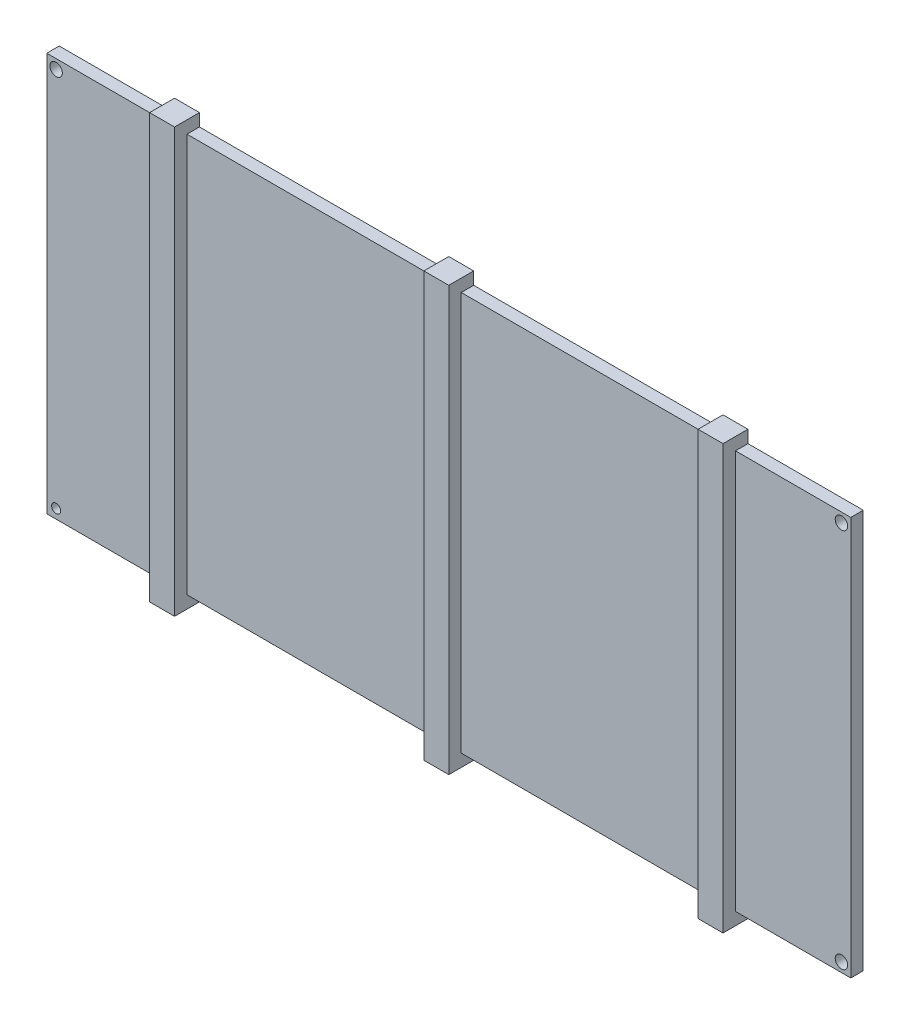
ISO-10303-21;
HEADER;
FILE_DESCRIPTION(('STEP AP214'),'2;1');
FILE_NAME('part.step','',(''),(''),'','','');
FILE_SCHEMA(('AUTOMOTIVE_DESIGN { 1 0 10303 214 1 1 1 1 }'));
ENDSEC;
DATA;
#1=APPLICATION_CONTEXT('core data for automotive mechanical design processes');
#2=APPLICATION_PROTOCOL_DEFINITION('international standard','automotive_design',2000,#1);
#3=PRODUCT_CONTEXT('',#1,'mechanical');
#4=PRODUCT('Part','Part','',(#3));
#5=PRODUCT_RELATED_PRODUCT_CATEGORY('part','',(#4));
#6=PRODUCT_DEFINITION_FORMATION('','',#4);
#7=PRODUCT_DEFINITION_CONTEXT('part definition',#1,'design');
#8=PRODUCT_DEFINITION('design','',#6,#7);
#9=PRODUCT_DEFINITION_SHAPE('','',#8);
#10=(LENGTH_UNIT() NAMED_UNIT(*) SI_UNIT(.MILLI.,.METRE.));
#11=(NAMED_UNIT(*) PLANE_ANGLE_UNIT() SI_UNIT($,.RADIAN.));
#12=(NAMED_UNIT(*) SI_UNIT($,.STERADIAN.) SOLID_ANGLE_UNIT());
#13=UNCERTAINTY_MEASURE_WITH_UNIT(LENGTH_MEASURE(1.E-05),#10,'distance_accuracy_value','');
#14=(GEOMETRIC_REPRESENTATION_CONTEXT(3) GLOBAL_UNCERTAINTY_ASSIGNED_CONTEXT((#13)) GLOBAL_UNIT_ASSIGNED_CONTEXT((#10,
#11,#12)) REPRESENTATION_CONTEXT('',''));
#15=CARTESIAN_POINT('',(0.,0.,0.));
#16=DIRECTION('',(0.,0.,1.));
#17=DIRECTION('',(1.,0.,0.));
#18=AXIS2_PLACEMENT_3D('',#15,#16,#17);
#19=CARTESIAN_POINT('',(0.,0.,2.));
#20=DIRECTION('',(0.,0.,-1.));
#21=DIRECTION('',(-1.,0.,0.));
#22=AXIS2_PLACEMENT_3D('',#19,#20,#21);
#23=PLANE('',#22);
#24=CARTESIAN_POINT('',(259.055719115068,122.680286747834,2.));
#25=DIRECTION('',(0.,0.,1.));
#26=DIRECTION('',(1.,0.,0.));
#27=AXIS2_PLACEMENT_3D('',#24,#25,#26);
#28=CIRCLE('',#27,0.724999999999974);
#29=CARTESIAN_POINT('',(259.780719115068,122.680286747834,2.));
#30=VERTEX_POINT('',#29);
#31=EDGE_CURVE('E379',#30,#30,#28,.T.);
#32=ORIENTED_EDGE('',*,*,#31,.F.);
#33=EDGE_LOOP('',(#32));
#34=FACE_BOUND('',#33,.T.);
#35=CARTESIAN_POINT('',(259.055719115068,183.680286747834,2.));
#36=DIRECTION('',(0.,0.,1.));
#37=DIRECTION('',(1.,0.,0.));
#38=AXIS2_PLACEMENT_3D('',#35,#36,#37);
#39=CIRCLE('',#38,0.999999999999998);
#40=CARTESIAN_POINT('',(260.055719115068,183.680286747834,2.));
#41=VERTEX_POINT('',#40);
#42=EDGE_CURVE('E362',#41,#41,#39,.T.);
#43=ORIENTED_EDGE('',*,*,#42,.F.);
#44=EDGE_LOOP('',(#43));
#45=FACE_BOUND('',#44,.T.);
#46=DIRECTION('',(0.,-1.,0.));
#47=VECTOR('',#46,1.);
#48=CARTESIAN_POINT('',(276.055719115068,187.180286747834,2.));
#49=LINE('',#48,#47);
#50=CARTESIAN_POINT('',(276.055719115068,185.180286747834,2.));
#51=VERTEX_POINT('',#50);
#52=CARTESIAN_POINT('',(276.055719115068,121.180286747834,2.));
#53=VERTEX_POINT('',#52);
#54=EDGE_CURVE('E361',#51,#53,#49,.T.);
#55=ORIENTED_EDGE('',*,*,#54,.F.);
#56=DIRECTION('',(-1.,0.,0.));
#57=VECTOR('',#56,1.);
#58=CARTESIAN_POINT('',(257.555719115068,185.180286747834,2.));
#59=LINE('',#58,#57);
#60=CARTESIAN_POINT('',(257.555719115068,185.180286747834,2.));
#61=VERTEX_POINT('',#60);
#62=EDGE_CURVE('E203',#51,#61,#59,.T.);
#63=ORIENTED_EDGE('',*,*,#62,.T.);
#64=DIRECTION('',(0.,-1.,0.));
#65=VECTOR('',#64,1.);
#66=CARTESIAN_POINT('',(257.555719115068,173.180286747834,2.));
#67=LINE('',#66,#65);
#68=CARTESIAN_POINT('',(257.555719115068,121.180286747834,2.));
#69=VERTEX_POINT('',#68);
#70=EDGE_CURVE('E197',#61,#69,#67,.T.);
#71=ORIENTED_EDGE('',*,*,#70,.T.);
#72=DIRECTION('',(1.,0.,0.));
#73=VECTOR('',#72,1.);
#74=CARTESIAN_POINT('',(276.055719115068,121.180286747834,2.));
#75=LINE('',#74,#73);
#76=EDGE_CURVE('E200',#69,#53,#75,.T.);
#77=ORIENTED_EDGE('',*,*,#76,.T.);
#78=EDGE_LOOP('',(#55,#63,#71,#77));
#79=FACE_BOUND('',#78,.T.);
#80=ADVANCED_FACE('F37',(#34,#45,#79),#23,.F.);
#81=DIRECTION('',(0.,1.,0.));
#82=VECTOR('',#81,1.);
#83=CARTESIAN_POINT('',(280.055719115068,187.180286747834,2.));
#84=LINE('',#83,#82);
#85=CARTESIAN_POINT('',(280.055719115068,121.180286747834,2.));
#86=VERTEX_POINT('',#85);
#87=CARTESIAN_POINT('',(280.055719115068,185.180286747834,2.));
#88=VERTEX_POINT('',#87);
#89=EDGE_CURVE('E385',#86,#88,#84,.T.);
#90=ORIENTED_EDGE('',*,*,#89,.F.);
#91=DIRECTION('',(1.,0.,0.));
#92=VECTOR('',#91,1.);
#93=CARTESIAN_POINT('',(311.555719115068,121.180286747834,2.));
#94=LINE('',#93,#92);
#95=CARTESIAN_POINT('',(320.055719115068,121.180286747834,2.));
#96=VERTEX_POINT('',#95);
#97=EDGE_CURVE('E56',#86,#96,#94,.T.);
#98=ORIENTED_EDGE('',*,*,#97,.T.);
#99=DIRECTION('',(0.,-1.,0.));
#100=VECTOR('',#99,1.);
#101=CARTESIAN_POINT('',(320.055719115068,187.180286747834,2.));
#102=LINE('',#101,#100);
#103=CARTESIAN_POINT('',(320.055719115068,185.180286747834,2.));
#104=VERTEX_POINT('',#103);
#105=EDGE_CURVE('E394',#104,#96,#102,.T.);
#106=ORIENTED_EDGE('',*,*,#105,.F.);
#107=DIRECTION('',(-1.,0.,0.));
#108=VECTOR('',#107,1.);
#109=CARTESIAN_POINT('',(280.055719115068,185.180286747834,2.));
#110=LINE('',#109,#108);
#111=EDGE_CURVE('E435',#104,#88,#110,.T.);
#112=ORIENTED_EDGE('',*,*,#111,.T.);
#113=EDGE_LOOP('',(#90,#98,#106,#112));
#114=FACE_BOUND('',#113,.T.);
#115=ADVANCED_FACE('F438',(#114),#23,.F.);
#116=DIRECTION('',(0.,1.,0.));
#117=VECTOR('',#116,1.);
#118=CARTESIAN_POINT('',(324.055719115068,187.180286747834,2.));
#119=LINE('',#118,#117);
#120=CARTESIAN_POINT('',(324.055719115068,121.180286747834,2.));
#121=VERTEX_POINT('',#120);
#122=CARTESIAN_POINT('',(324.055719115068,185.180286747834,2.));
#123=VERTEX_POINT('',#122);
#124=EDGE_CURVE('E161',#121,#123,#119,.T.);
#125=ORIENTED_EDGE('',*,*,#124,.F.);
#126=DIRECTION('',(1.,0.,0.));
#127=VECTOR('',#126,1.);
#128=CARTESIAN_POINT('',(324.055719115068,121.180286747834,2.));
#129=LINE('',#128,#127);
#130=CARTESIAN_POINT('',(364.055719115068,121.180286747834,2.));
#131=VERTEX_POINT('',#130);
#132=EDGE_CURVE('E283',#121,#131,#129,.T.);
#133=ORIENTED_EDGE('',*,*,#132,.T.);
#134=DIRECTION('',(0.,-1.,0.));
#135=VECTOR('',#134,1.);
#136=CARTESIAN_POINT('',(364.055719115068,187.180286747834,2.));
#137=LINE('',#136,#135);
#138=CARTESIAN_POINT('',(364.055719115068,185.180286747834,2.));
#139=VERTEX_POINT('',#138);
#140=EDGE_CURVE('E11',#139,#131,#137,.T.);
#141=ORIENTED_EDGE('',*,*,#140,.F.);
#142=DIRECTION('',(-1.,0.,0.));
#143=VECTOR('',#142,1.);
#144=CARTESIAN_POINT('',(324.055719115068,185.180286747834,2.));
#145=LINE('',#144,#143);
#146=EDGE_CURVE('E433',#139,#123,#145,.T.);
#147=ORIENTED_EDGE('',*,*,#146,.T.);
#148=EDGE_LOOP('',(#125,#133,#141,#147));
#149=FACE_BOUND('',#148,.T.);
#150=ADVANCED_FACE('F556',(#149),#23,.F.);
#151=CARTESIAN_POINT('',(385.055719115068,183.680286747834,2.));
#152=DIRECTION('',(0.,0.,1.));
#153=DIRECTION('',(1.,0.,0.));
#154=AXIS2_PLACEMENT_3D('',#151,#152,#153);
#155=CIRCLE('',#154,0.999999999999998);
#156=CARTESIAN_POINT('',(386.055719115068,183.680286747834,2.));
#157=VERTEX_POINT('',#156);
#158=EDGE_CURVE('E366',#157,#157,#155,.T.);
#159=ORIENTED_EDGE('',*,*,#158,.F.);
#160=EDGE_LOOP('',(#159));
#161=FACE_BOUND('',#160,.T.);
#162=CARTESIAN_POINT('',(385.055719115068,122.680286747834,2.));
#163=DIRECTION('',(0.,0.,1.));
#164=DIRECTION('',(1.,0.,0.));
#165=AXIS2_PLACEMENT_3D('',#162,#163,#164);
#166=CIRCLE('',#165,0.999999999999998);
#167=CARTESIAN_POINT('',(386.055719115068,122.680286747834,2.));
#168=VERTEX_POINT('',#167);
#169=EDGE_CURVE('E589',#168,#168,#166,.T.);
#170=ORIENTED_EDGE('',*,*,#169,.F.);
#171=EDGE_LOOP('',(#170));
#172=FACE_BOUND('',#171,.T.);
#173=DIRECTION('',(0.,1.,0.));
#174=VECTOR('',#173,1.);
#175=CARTESIAN_POINT('',(368.055719115068,187.180286747834,2.));
#176=LINE('',#175,#174);
#177=CARTESIAN_POINT('',(368.055719115068,121.180286747834,2.));
#178=VERTEX_POINT('',#177);
#179=CARTESIAN_POINT('',(368.055719115068,185.180286747834,2.));
#180=VERTEX_POINT('',#179);
#181=EDGE_CURVE('E47',#178,#180,#176,.T.);
#182=ORIENTED_EDGE('',*,*,#181,.F.);
#183=DIRECTION('',(1.,0.,0.));
#184=VECTOR('',#183,1.);
#185=CARTESIAN_POINT('',(386.555719115068,121.180286747834,2.));
#186=LINE('',#185,#184);
#187=CARTESIAN_POINT('',(386.555719115068,121.180286747834,2.));
#188=VERTEX_POINT('',#187);
#189=EDGE_CURVE('E427',#178,#188,#186,.T.);
#190=ORIENTED_EDGE('',*,*,#189,.T.);
#191=DIRECTION('',(0.,1.,0.));
#192=VECTOR('',#191,1.);
#193=CARTESIAN_POINT('',(386.555719115068,133.180286747834,2.));
#194=LINE('',#193,#192);
#195=CARTESIAN_POINT('',(386.555719115068,185.180286747834,2.));
#196=VERTEX_POINT('',#195);
#197=EDGE_CURVE('E429',#188,#196,#194,.T.);
#198=ORIENTED_EDGE('',*,*,#197,.T.);
#199=DIRECTION('',(-1.,0.,0.));
#200=VECTOR('',#199,1.);
#201=CARTESIAN_POINT('',(368.055719115068,185.180286747834,2.));
#202=LINE('',#201,#200);
#203=EDGE_CURVE('E431',#196,#180,#202,.T.);
#204=ORIENTED_EDGE('',*,*,#203,.T.);
#205=EDGE_LOOP('',(#182,#190,#198,#204));
#206=FACE_BOUND('',#205,.T.);
#207=ADVANCED_FACE('F545',(#161,#172,#206),#23,.F.);
#208=CARTESIAN_POINT('',(322.055719115068,119.180286747834,2.));
#209=DIRECTION('',(0.,1.,0.));
#210=DIRECTION('',(0.,0.,1.));
#211=AXIS2_PLACEMENT_3D('',#208,#209,#210);
#212=PLANE('',#211);
#213=DIRECTION('',(1.,0.,0.));
#214=VECTOR('',#213,1.);
#215=CARTESIAN_POINT('',(322.055719115068,119.180286747834,0.));
#216=LINE('',#215,#214);
#217=CARTESIAN_POINT('',(320.055719115068,119.180286747834,0.));
#218=VERTEX_POINT('',#217);
#219=CARTESIAN_POINT('',(324.055719115068,119.180286747834,0.));
#220=VERTEX_POINT('',#219);
#221=EDGE_CURVE('E152',#218,#220,#216,.T.);
#222=ORIENTED_EDGE('',*,*,#221,.T.);
#223=DIRECTION('',(0.,0.,-1.));
#224=VECTOR('',#223,1.);
#225=CARTESIAN_POINT('',(324.055719115068,119.180286747834,2.));
#226=LINE('',#225,#224);
#227=CARTESIAN_POINT('',(324.055719115068,119.180286747834,4.));
#228=VERTEX_POINT('',#227);
#229=EDGE_CURVE('E355',#228,#220,#226,.T.);
#230=ORIENTED_EDGE('',*,*,#229,.F.);
#231=DIRECTION('',(1.,0.,0.));
#232=VECTOR('',#231,1.);
#233=CARTESIAN_POINT('',(320.055719115068,119.180286747834,4.));
#234=LINE('',#233,#232);
#235=CARTESIAN_POINT('',(320.055719115068,119.180286747834,4.));
#236=VERTEX_POINT('',#235);
#237=EDGE_CURVE('E401',#236,#228,#234,.T.);
#238=ORIENTED_EDGE('',*,*,#237,.F.);
#239=DIRECTION('',(0.,0.,-1.));
#240=VECTOR('',#239,1.);
#241=CARTESIAN_POINT('',(320.055719115068,119.180286747834,2.));
#242=LINE('',#241,#240);
#243=EDGE_CURVE('E221',#236,#218,#242,.T.);
#244=ORIENTED_EDGE('',*,*,#243,.T.);
#245=EDGE_LOOP('',(#222,#230,#238,#244));
#246=FACE_BOUND('',#245,.T.);
#247=ADVANCED_FACE('F39',(#246),#212,.F.);
#248=CARTESIAN_POINT('',(364.055719115068,121.180286747834,2.));
#249=DIRECTION('',(0.,1.,0.));
#250=DIRECTION('',(-1.,0.,0.));
#251=AXIS2_PLACEMENT_3D('',#248,#249,#250);
#252=PLANE('',#251);
#253=DIRECTION('',(1.,0.,0.));
#254=VECTOR('',#253,1.);
#255=CARTESIAN_POINT('',(364.055719115068,121.180286747834,0.));
#256=LINE('',#255,#254);
#257=CARTESIAN_POINT('',(324.055719115068,121.180286747834,0.));
#258=VERTEX_POINT('',#257);
#259=CARTESIAN_POINT('',(364.055719115068,121.180286747834,0.));
#260=VERTEX_POINT('',#259);
#261=EDGE_CURVE('E230',#258,#260,#256,.T.);
#262=ORIENTED_EDGE('',*,*,#261,.T.);
#263=DIRECTION('',(0.,0.,-1.));
#264=VECTOR('',#263,1.);
#265=CARTESIAN_POINT('',(364.055719115068,121.180286747834,2.));
#266=LINE('',#265,#264);
#267=EDGE_CURVE('E349',#131,#260,#266,.T.);
#268=ORIENTED_EDGE('',*,*,#267,.F.);
#269=ORIENTED_EDGE('',*,*,#132,.F.);
#270=DIRECTION('',(0.,0.,-1.));
#271=VECTOR('',#270,1.);
#272=CARTESIAN_POINT('',(324.055719115068,121.180286747834,2.));
#273=LINE('',#272,#271);
#274=EDGE_CURVE('E352',#121,#258,#273,.T.);
#275=ORIENTED_EDGE('',*,*,#274,.T.);
#276=EDGE_LOOP('',(#262,#268,#269,#275));
#277=FACE_BOUND('',#276,.T.);
#278=ADVANCED_FACE('F562',(#277),#252,.F.);
#279=CARTESIAN_POINT('',(368.055719115068,119.180286747834,2.));
#280=DIRECTION('',(0.,1.,0.));
#281=DIRECTION('',(0.,0.,1.));
#282=AXIS2_PLACEMENT_3D('',#279,#280,#281);
#283=PLANE('',#282);
#284=DIRECTION('',(1.,0.,0.));
#285=VECTOR('',#284,1.);
#286=CARTESIAN_POINT('',(368.055719115068,119.180286747834,0.));
#287=LINE('',#286,#285);
#288=CARTESIAN_POINT('',(364.055719115068,119.180286747834,0.));
#289=VERTEX_POINT('',#288);
#290=CARTESIAN_POINT('',(368.055719115068,119.180286747834,0.));
#291=VERTEX_POINT('',#290);
#292=EDGE_CURVE('E234',#289,#291,#287,.T.);
#293=ORIENTED_EDGE('',*,*,#292,.T.);
#294=DIRECTION('',(0.,0.,-1.));
#295=VECTOR('',#294,1.);
#296=CARTESIAN_POINT('',(368.055719115068,119.180286747834,2.));
#297=LINE('',#296,#295);
#298=CARTESIAN_POINT('',(368.055719115068,119.180286747834,4.));
#299=VERTEX_POINT('',#298);
#300=EDGE_CURVE('E343',#299,#291,#297,.T.);
#301=ORIENTED_EDGE('',*,*,#300,.F.);
#302=DIRECTION('',(1.,0.,0.));
#303=VECTOR('',#302,1.);
#304=CARTESIAN_POINT('',(364.055719115068,119.180286747834,4.));
#305=LINE('',#304,#303);
#306=CARTESIAN_POINT('',(364.055719115068,119.180286747834,4.));
#307=VERTEX_POINT('',#306);
#308=EDGE_CURVE('E416',#307,#299,#305,.T.);
#309=ORIENTED_EDGE('',*,*,#308,.F.);
#310=DIRECTION('',(0.,0.,-1.));
#311=VECTOR('',#310,1.);
#312=CARTESIAN_POINT('',(364.055719115068,119.180286747834,2.));
#313=LINE('',#312,#311);
#314=EDGE_CURVE('E346',#307,#289,#313,.T.);
#315=ORIENTED_EDGE('',*,*,#314,.T.);
#316=EDGE_LOOP('',(#293,#301,#309,#315));
#317=FACE_BOUND('',#316,.T.);
#318=ADVANCED_FACE('F529',(#317),#283,.F.);
#319=CARTESIAN_POINT('',(386.555719115068,121.180286747834,2.));
#320=DIRECTION('',(0.,1.,0.));
#321=DIRECTION('',(-1.,0.,0.));
#322=AXIS2_PLACEMENT_3D('',#319,#320,#321);
#323=PLANE('',#322);
#324=DIRECTION('',(1.,0.,0.));
#325=VECTOR('',#324,1.);
#326=CARTESIAN_POINT('',(386.555719115068,121.180286747834,0.));
#327=LINE('',#326,#325);
#328=CARTESIAN_POINT('',(368.055719115068,121.180286747834,0.));
#329=VERTEX_POINT('',#328);
#330=CARTESIAN_POINT('',(386.555719115068,121.180286747834,0.));
#331=VERTEX_POINT('',#330);
#332=EDGE_CURVE('E238',#329,#331,#327,.T.);
#333=ORIENTED_EDGE('',*,*,#332,.T.);
#334=DIRECTION('',(0.,0.,-1.));
#335=VECTOR('',#334,1.);
#336=CARTESIAN_POINT('',(386.555719115068,121.180286747834,2.));
#337=LINE('',#336,#335);
#338=EDGE_CURVE('E337',#188,#331,#337,.T.);
#339=ORIENTED_EDGE('',*,*,#338,.F.);
#340=ORIENTED_EDGE('',*,*,#189,.F.);
#341=DIRECTION('',(0.,0.,-1.));
#342=VECTOR('',#341,1.);
#343=CARTESIAN_POINT('',(368.055719115068,121.180286747834,2.));
#344=LINE('',#343,#342);
#345=EDGE_CURVE('E340',#178,#329,#344,.T.);
#346=ORIENTED_EDGE('',*,*,#345,.T.);
#347=EDGE_LOOP('',(#333,#339,#340,#346));
#348=FACE_BOUND('',#347,.T.);
#349=ADVANCED_FACE('F537',(#348),#323,.F.);
#350=CARTESIAN_POINT('',(386.555719115068,185.180286747834,2.));
#351=DIRECTION('',(-1.,0.,0.));
#352=DIRECTION('',(0.,0.,1.));
#353=AXIS2_PLACEMENT_3D('',#350,#351,#352);
#354=PLANE('',#353);
#355=DIRECTION('',(0.,1.,0.));
#356=VECTOR('',#355,1.);
#357=CARTESIAN_POINT('',(386.555719115068,185.180286747834,0.));
#358=LINE('',#357,#356);
#359=CARTESIAN_POINT('',(386.555719115068,185.180286747834,0.));
#360=VERTEX_POINT('',#359);
#361=EDGE_CURVE('E241',#331,#360,#358,.T.);
#362=ORIENTED_EDGE('',*,*,#361,.T.);
#363=DIRECTION('',(0.,0.,-1.));
#364=VECTOR('',#363,1.);
#365=CARTESIAN_POINT('',(386.555719115068,185.180286747834,2.));
#366=LINE('',#365,#364);
#367=EDGE_CURVE('E334',#196,#360,#366,.T.);
#368=ORIENTED_EDGE('',*,*,#367,.F.);
#369=ORIENTED_EDGE('',*,*,#197,.F.);
#370=ORIENTED_EDGE('',*,*,#338,.T.);
#371=EDGE_LOOP('',(#362,#368,#369,#370));
#372=FACE_BOUND('',#371,.T.);
#373=ADVANCED_FACE('F541',(#372),#354,.F.);
#374=CARTESIAN_POINT('',(368.055719115068,185.180286747834,2.));
#375=DIRECTION('',(0.,-1.,0.));
#376=DIRECTION('',(1.,0.,0.));
#377=AXIS2_PLACEMENT_3D('',#374,#375,#376);
#378=PLANE('',#377);
#379=DIRECTION('',(-1.,0.,0.));
#380=VECTOR('',#379,1.);
#381=CARTESIAN_POINT('',(368.055719115068,185.180286747834,0.));
#382=LINE('',#381,#380);
#383=CARTESIAN_POINT('',(368.055719115068,185.180286747834,0.));
#384=VERTEX_POINT('',#383);
#385=EDGE_CURVE('E243',#360,#384,#382,.T.);
#386=ORIENTED_EDGE('',*,*,#385,.T.);
#387=DIRECTION('',(0.,0.,-1.));
#388=VECTOR('',#387,1.);
#389=CARTESIAN_POINT('',(368.055719115068,185.180286747834,2.));
#390=LINE('',#389,#388);
#391=EDGE_CURVE('E331',#180,#384,#390,.T.);
#392=ORIENTED_EDGE('',*,*,#391,.F.);
#393=ORIENTED_EDGE('',*,*,#203,.F.);
#394=ORIENTED_EDGE('',*,*,#367,.T.);
#395=EDGE_LOOP('',(#386,#392,#393,#394));
#396=FACE_BOUND('',#395,.T.);
#397=ADVANCED_FACE('F657',(#396),#378,.F.);
#398=CARTESIAN_POINT('',(368.055719115068,185.180286747834,2.));
#399=DIRECTION('',(-1.,0.,0.));
#400=DIRECTION('',(0.,0.,1.));
#401=AXIS2_PLACEMENT_3D('',#398,#399,#400);
#402=PLANE('',#401);
#403=DIRECTION('',(0.,1.,0.));
#404=VECTOR('',#403,1.);
#405=CARTESIAN_POINT('',(368.055719115068,185.180286747834,0.));
#406=LINE('',#405,#404);
#407=CARTESIAN_POINT('',(368.055719115068,187.180286747834,0.));
#408=VERTEX_POINT('',#407);
#409=EDGE_CURVE('E245',#384,#408,#406,.T.);
#410=ORIENTED_EDGE('',*,*,#409,.T.);
#411=DIRECTION('',(0.,0.,-1.));
#412=VECTOR('',#411,1.);
#413=CARTESIAN_POINT('',(368.055719115068,187.180286747834,2.));
#414=LINE('',#413,#412);
#415=CARTESIAN_POINT('',(368.055719115068,187.180286747834,4.));
#416=VERTEX_POINT('',#415);
#417=EDGE_CURVE('E328',#416,#408,#414,.T.);
#418=ORIENTED_EDGE('',*,*,#417,.F.);
#419=DIRECTION('',(0.,1.,0.));
#420=VECTOR('',#419,1.);
#421=CARTESIAN_POINT('',(368.055719115068,187.180286747834,4.));
#422=LINE('',#421,#420);
#423=EDGE_CURVE('E419',#299,#416,#422,.T.);
#424=ORIENTED_EDGE('',*,*,#423,.F.);
#425=ORIENTED_EDGE('',*,*,#300,.T.);
#426=DIRECTION('',(0.,1.,0.));
#427=VECTOR('',#426,1.);
#428=CARTESIAN_POINT('',(368.055719115068,121.180286747834,0.));
#429=LINE('',#428,#427);
#430=EDGE_CURVE('E236',#291,#329,#429,.T.);
#431=ORIENTED_EDGE('',*,*,#430,.T.);
#432=ORIENTED_EDGE('',*,*,#345,.F.);
#433=ORIENTED_EDGE('',*,*,#181,.T.);
#434=ORIENTED_EDGE('',*,*,#391,.T.);
#435=EDGE_LOOP('',(#410,#418,#424,#425,#431,#432,#433,#434));
#436=FACE_BOUND('',#435,.T.);
#437=ADVANCED_FACE('F530',(#436),#402,.F.);
#438=CARTESIAN_POINT('',(368.055719115068,187.180286747834,2.));
#439=DIRECTION('',(0.,-1.,0.));
#440=DIRECTION('',(0.,0.,-1.));
#441=AXIS2_PLACEMENT_3D('',#438,#439,#440);
#442=PLANE('',#441);
#443=DIRECTION('',(-1.,0.,0.));
#444=VECTOR('',#443,1.);
#445=CARTESIAN_POINT('',(368.055719115068,187.180286747834,0.));
#446=LINE('',#445,#444);
#447=CARTESIAN_POINT('',(364.055719115068,187.180286747834,0.));
#448=VERTEX_POINT('',#447);
#449=EDGE_CURVE('E247',#408,#448,#446,.T.);
#450=ORIENTED_EDGE('',*,*,#449,.T.);
#451=DIRECTION('',(0.,0.,-1.));
#452=VECTOR('',#451,1.);
#453=CARTESIAN_POINT('',(364.055719115068,187.180286747834,2.));
#454=LINE('',#453,#452);
#455=CARTESIAN_POINT('',(364.055719115068,187.180286747834,4.));
#456=VERTEX_POINT('',#455);
#457=EDGE_CURVE('E325',#456,#448,#454,.T.);
#458=ORIENTED_EDGE('',*,*,#457,.F.);
#459=DIRECTION('',(-1.,0.,0.));
#460=VECTOR('',#459,1.);
#461=CARTESIAN_POINT('',(368.055719115068,187.180286747834,4.));
#462=LINE('',#461,#460);
#463=EDGE_CURVE('E227',#416,#456,#462,.T.);
#464=ORIENTED_EDGE('',*,*,#463,.F.);
#465=ORIENTED_EDGE('',*,*,#417,.T.);
#466=EDGE_LOOP('',(#450,#458,#464,#465));
#467=FACE_BOUND('',#466,.T.);
#468=ADVANCED_FACE('F517',(#467),#442,.F.);
#469=CARTESIAN_POINT('',(364.055719115068,187.180286747834,2.));
#470=DIRECTION('',(1.,0.,0.));
#471=DIRECTION('',(0.,0.,-1.));
#472=AXIS2_PLACEMENT_3D('',#469,#470,#471);
#473=PLANE('',#472);
#474=DIRECTION('',(0.,-1.,0.));
#475=VECTOR('',#474,1.);
#476=CARTESIAN_POINT('',(364.055719115068,187.180286747834,0.));
#477=LINE('',#476,#475);
#478=CARTESIAN_POINT('',(364.055719115068,185.180286747834,0.));
#479=VERTEX_POINT('',#478);
#480=EDGE_CURVE('E249',#448,#479,#477,.T.);
#481=ORIENTED_EDGE('',*,*,#480,.T.);
#482=DIRECTION('',(0.,0.,-1.));
#483=VECTOR('',#482,1.);
#484=CARTESIAN_POINT('',(364.055719115068,185.180286747834,2.));
#485=LINE('',#484,#483);
#486=EDGE_CURVE('E322',#139,#479,#485,.T.);
#487=ORIENTED_EDGE('',*,*,#486,.F.);
#488=ORIENTED_EDGE('',*,*,#140,.T.);
#489=ORIENTED_EDGE('',*,*,#267,.T.);
#490=DIRECTION('',(0.,-1.,0.));
#491=VECTOR('',#490,1.);
#492=CARTESIAN_POINT('',(364.055719115068,119.180286747834,0.));
#493=LINE('',#492,#491);
#494=EDGE_CURVE('E232',#260,#289,#493,.T.);
#495=ORIENTED_EDGE('',*,*,#494,.T.);
#496=ORIENTED_EDGE('',*,*,#314,.F.);
#497=DIRECTION('',(0.,-1.,0.));
#498=VECTOR('',#497,1.);
#499=CARTESIAN_POINT('',(364.055719115068,187.180286747834,4.));
#500=LINE('',#499,#498);
#501=EDGE_CURVE('E410',#456,#307,#500,.T.);
#502=ORIENTED_EDGE('',*,*,#501,.F.);
#503=ORIENTED_EDGE('',*,*,#457,.T.);
#504=EDGE_LOOP('',(#481,#487,#488,#489,#495,#496,#502,#503));
#505=FACE_BOUND('',#504,.T.);
#506=ADVANCED_FACE('F524',(#505),#473,.F.);
#507=CARTESIAN_POINT('',(324.055719115068,185.180286747834,2.));
#508=DIRECTION('',(0.,-1.,0.));
#509=DIRECTION('',(0.,0.,-1.));
#510=AXIS2_PLACEMENT_3D('',#507,#508,#509);
#511=PLANE('',#510);
#512=DIRECTION('',(-1.,0.,0.));
#513=VECTOR('',#512,1.);
#514=CARTESIAN_POINT('',(324.055719115068,185.180286747834,0.));
#515=LINE('',#514,#513);
#516=CARTESIAN_POINT('',(324.055719115068,185.180286747834,0.));
#517=VERTEX_POINT('',#516);
#518=EDGE_CURVE('E251',#479,#517,#515,.T.);
#519=ORIENTED_EDGE('',*,*,#518,.T.);
#520=DIRECTION('',(0.,0.,-1.));
#521=VECTOR('',#520,1.);
#522=CARTESIAN_POINT('',(324.055719115068,185.180286747834,2.));
#523=LINE('',#522,#521);
#524=EDGE_CURVE('E319',#123,#517,#523,.T.);
#525=ORIENTED_EDGE('',*,*,#524,.F.);
#526=ORIENTED_EDGE('',*,*,#146,.F.);
#527=ORIENTED_EDGE('',*,*,#486,.T.);
#528=EDGE_LOOP('',(#519,#525,#526,#527));
#529=FACE_BOUND('',#528,.T.);
#530=ADVANCED_FACE('F554',(#529),#511,.F.);
#531=CARTESIAN_POINT('',(324.055719115068,185.180286747834,2.));
#532=DIRECTION('',(-1.,0.,0.));
#533=DIRECTION('',(0.,0.,1.));
#534=AXIS2_PLACEMENT_3D('',#531,#532,#533);
#535=PLANE('',#534);
#536=DIRECTION('',(0.,1.,0.));
#537=VECTOR('',#536,1.);
#538=CARTESIAN_POINT('',(324.055719115068,185.180286747834,0.));
#539=LINE('',#538,#537);
#540=CARTESIAN_POINT('',(324.055719115068,187.180286747834,0.));
#541=VERTEX_POINT('',#540);
#542=EDGE_CURVE('E253',#517,#541,#539,.T.);
#543=ORIENTED_EDGE('',*,*,#542,.T.);
#544=DIRECTION('',(0.,0.,-1.));
#545=VECTOR('',#544,1.);
#546=CARTESIAN_POINT('',(324.055719115068,187.180286747834,2.));
#547=LINE('',#546,#545);
#548=CARTESIAN_POINT('',(324.055719115068,187.180286747834,4.));
#549=VERTEX_POINT('',#548);
#550=EDGE_CURVE('E316',#549,#541,#547,.T.);
#551=ORIENTED_EDGE('',*,*,#550,.F.);
#552=DIRECTION('',(0.,1.,0.));
#553=VECTOR('',#552,1.);
#554=CARTESIAN_POINT('',(324.055719115068,187.180286747834,4.));
#555=LINE('',#554,#553);
#556=EDGE_CURVE('E404',#228,#549,#555,.T.);
#557=ORIENTED_EDGE('',*,*,#556,.F.);
#558=ORIENTED_EDGE('',*,*,#229,.T.);
#559=DIRECTION('',(0.,1.,0.));
#560=VECTOR('',#559,1.);
#561=CARTESIAN_POINT('',(324.055719115068,119.180286747834,0.));
#562=LINE('',#561,#560);
#563=EDGE_CURVE('E226',#220,#258,#562,.T.);
#564=ORIENTED_EDGE('',*,*,#563,.T.);
#565=ORIENTED_EDGE('',*,*,#274,.F.);
#566=ORIENTED_EDGE('',*,*,#124,.T.);
#567=ORIENTED_EDGE('',*,*,#524,.T.);
#568=EDGE_LOOP('',(#543,#551,#557,#558,#564,#565,#566,#567));
#569=FACE_BOUND('',#568,.T.);
#570=ADVANCED_FACE('F561',(#569),#535,.F.);
#571=CARTESIAN_POINT('',(324.055719115068,187.180286747834,2.));
#572=DIRECTION('',(0.,-1.,0.));
#573=DIRECTION('',(0.,0.,-1.));
#574=AXIS2_PLACEMENT_3D('',#571,#572,#573);
#575=PLANE('',#574);
#576=DIRECTION('',(-1.,0.,0.));
#577=VECTOR('',#576,1.);
#578=CARTESIAN_POINT('',(324.055719115068,187.180286747834,0.));
#579=LINE('',#578,#577);
#580=CARTESIAN_POINT('',(320.055719115068,187.180286747834,0.));
#581=VERTEX_POINT('',#580);
#582=EDGE_CURVE('E255',#541,#581,#579,.T.);
#583=ORIENTED_EDGE('',*,*,#582,.T.);
#584=DIRECTION('',(0.,0.,-1.));
#585=VECTOR('',#584,1.);
#586=CARTESIAN_POINT('',(320.055719115068,187.180286747834,2.));
#587=LINE('',#586,#585);
#588=CARTESIAN_POINT('',(320.055719115068,187.180286747834,4.));
#589=VERTEX_POINT('',#588);
#590=EDGE_CURVE('E313',#589,#581,#587,.T.);
#591=ORIENTED_EDGE('',*,*,#590,.F.);
#592=DIRECTION('',(-1.,0.,0.));
#593=VECTOR('',#592,1.);
#594=CARTESIAN_POINT('',(324.055719115068,187.180286747834,4.));
#595=LINE('',#594,#593);
#596=EDGE_CURVE('E407',#549,#589,#595,.T.);
#597=ORIENTED_EDGE('',*,*,#596,.F.);
#598=ORIENTED_EDGE('',*,*,#550,.T.);
#599=EDGE_LOOP('',(#583,#591,#597,#598));
#600=FACE_BOUND('',#599,.T.);
#601=ADVANCED_FACE('F644',(#600),#575,.F.);
#602=CARTESIAN_POINT('',(280.055719115068,185.180286747834,2.));
#603=DIRECTION('',(0.,-1.,0.));
#604=DIRECTION('',(0.,0.,-1.));
#605=AXIS2_PLACEMENT_3D('',#602,#603,#604);
#606=PLANE('',#605);
#607=DIRECTION('',(-1.,0.,0.));
#608=VECTOR('',#607,1.);
#609=CARTESIAN_POINT('',(280.055719115068,185.180286747834,0.));
#610=LINE('',#609,#608);
#611=CARTESIAN_POINT('',(320.055719115068,185.180286747834,0.));
#612=VERTEX_POINT('',#611);
#613=CARTESIAN_POINT('',(280.055719115068,185.180286747834,0.));
#614=VERTEX_POINT('',#613);
#615=EDGE_CURVE('E259',#612,#614,#610,.T.);
#616=ORIENTED_EDGE('',*,*,#615,.T.);
#617=DIRECTION('',(0.,0.,-1.));
#618=VECTOR('',#617,1.);
#619=CARTESIAN_POINT('',(280.055719115068,185.180286747834,2.));
#620=LINE('',#619,#618);
#621=EDGE_CURVE('E307',#88,#614,#620,.T.);
#622=ORIENTED_EDGE('',*,*,#621,.F.);
#623=ORIENTED_EDGE('',*,*,#111,.F.);
#624=DIRECTION('',(0.,0.,-1.));
#625=VECTOR('',#624,1.);
#626=CARTESIAN_POINT('',(320.055719115068,185.180286747834,2.));
#627=LINE('',#626,#625);
#628=EDGE_CURVE('E310',#104,#612,#627,.T.);
#629=ORIENTED_EDGE('',*,*,#628,.T.);
#630=EDGE_LOOP('',(#616,#622,#623,#629));
#631=FACE_BOUND('',#630,.T.);
#632=ADVANCED_FACE('F442',(#631),#606,.F.);
#633=CARTESIAN_POINT('',(280.055719115068,187.180286747834,2.));
#634=DIRECTION('',(0.,-1.,0.));
#635=DIRECTION('',(0.,0.,-1.));
#636=AXIS2_PLACEMENT_3D('',#633,#634,#635);
#637=PLANE('',#636);
#638=DIRECTION('',(-1.,0.,0.));
#639=VECTOR('',#638,1.);
#640=CARTESIAN_POINT('',(280.055719115068,187.180286747834,0.));
#641=LINE('',#640,#639);
#642=CARTESIAN_POINT('',(280.055719115068,187.180286747834,0.));
#643=VERTEX_POINT('',#642);
#644=CARTESIAN_POINT('',(276.055719115068,187.180286747834,0.));
#645=VERTEX_POINT('',#644);
#646=EDGE_CURVE('E263',#643,#645,#641,.T.);
#647=ORIENTED_EDGE('',*,*,#646,.T.);
#648=DIRECTION('',(0.,0.,-1.));
#649=VECTOR('',#648,1.);
#650=CARTESIAN_POINT('',(276.055719115068,187.180286747834,2.));
#651=LINE('',#650,#649);
#652=CARTESIAN_POINT('',(276.055719115068,187.180286747834,4.));
#653=VERTEX_POINT('',#652);
#654=EDGE_CURVE('E301',#653,#645,#651,.T.);
#655=ORIENTED_EDGE('',*,*,#654,.F.);
#656=DIRECTION('',(-1.,0.,0.));
#657=VECTOR('',#656,1.);
#658=CARTESIAN_POINT('',(280.055719115068,187.180286747834,4.));
#659=LINE('',#658,#657);
#660=CARTESIAN_POINT('',(280.055719115068,187.180286747834,4.));
#661=VERTEX_POINT('',#660);
#662=EDGE_CURVE('E391',#661,#653,#659,.T.);
#663=ORIENTED_EDGE('',*,*,#662,.F.);
#664=DIRECTION('',(0.,0.,-1.));
#665=VECTOR('',#664,1.);
#666=CARTESIAN_POINT('',(280.055719115068,187.180286747834,2.));
#667=LINE('',#666,#665);
#668=EDGE_CURVE('E304',#661,#643,#667,.T.);
#669=ORIENTED_EDGE('',*,*,#668,.T.);
#670=EDGE_LOOP('',(#647,#655,#663,#669));
#671=FACE_BOUND('',#670,.T.);
#672=ADVANCED_FACE('F465',(#671),#637,.F.);
#673=CARTESIAN_POINT('',(257.555719115068,185.180286747834,2.));
#674=DIRECTION('',(0.,-1.,0.));
#675=DIRECTION('',(0.,0.,-1.));
#676=AXIS2_PLACEMENT_3D('',#673,#674,#675);
#677=PLANE('',#676);
#678=DIRECTION('',(-1.,0.,0.));
#679=VECTOR('',#678,1.);
#680=CARTESIAN_POINT('',(257.555719115068,185.180286747834,0.));
#681=LINE('',#680,#679);
#682=CARTESIAN_POINT('',(276.055719115068,185.180286747834,0.));
#683=VERTEX_POINT('',#682);
#684=CARTESIAN_POINT('',(257.555719115068,185.180286747834,0.));
#685=VERTEX_POINT('',#684);
#686=EDGE_CURVE('E267',#683,#685,#681,.T.);
#687=ORIENTED_EDGE('',*,*,#686,.T.);
#688=DIRECTION('',(0.,0.,-1.));
#689=VECTOR('',#688,1.);
#690=CARTESIAN_POINT('',(257.555719115068,185.180286747834,2.));
#691=LINE('',#690,#689);
#692=EDGE_CURVE('E214',#61,#685,#691,.T.);
#693=ORIENTED_EDGE('',*,*,#692,.F.);
#694=ORIENTED_EDGE('',*,*,#62,.F.);
#695=DIRECTION('',(0.,0.,-1.));
#696=VECTOR('',#695,1.);
#697=CARTESIAN_POINT('',(276.055719115068,185.180286747834,2.));
#698=LINE('',#697,#696);
#699=EDGE_CURVE('E298',#51,#683,#698,.T.);
#700=ORIENTED_EDGE('',*,*,#699,.T.);
#701=EDGE_LOOP('',(#687,#693,#694,#700));
#702=FACE_BOUND('',#701,.T.);
#703=ADVANCED_FACE('F636',(#702),#677,.F.);
#704=CARTESIAN_POINT('',(257.555719115068,121.180286747834,2.));
#705=DIRECTION('',(1.,0.,0.));
#706=DIRECTION('',(0.,0.,-1.));
#707=AXIS2_PLACEMENT_3D('',#704,#705,#706);
#708=PLANE('',#707);
#709=DIRECTION('',(0.,-1.,0.));
#710=VECTOR('',#709,1.);
#711=CARTESIAN_POINT('',(257.555719115068,121.180286747834,0.));
#712=LINE('',#711,#710);
#713=CARTESIAN_POINT('',(257.555719115068,121.180286747834,0.));
#714=VERTEX_POINT('',#713);
#715=EDGE_CURVE('E211',#685,#714,#712,.T.);
#716=ORIENTED_EDGE('',*,*,#715,.T.);
#717=DIRECTION('',(0.,0.,-1.));
#718=VECTOR('',#717,1.);
#719=CARTESIAN_POINT('',(257.555719115068,121.180286747834,2.));
#720=LINE('',#719,#718);
#721=EDGE_CURVE('E209',#69,#714,#720,.T.);
#722=ORIENTED_EDGE('',*,*,#721,.F.);
#723=ORIENTED_EDGE('',*,*,#70,.F.);
#724=ORIENTED_EDGE('',*,*,#692,.T.);
#725=EDGE_LOOP('',(#716,#722,#723,#724));
#726=FACE_BOUND('',#725,.T.);
#727=ADVANCED_FACE('F210',(#726),#708,.F.);
#728=CARTESIAN_POINT('',(276.055719115068,121.180286747834,2.));
#729=DIRECTION('',(0.,1.,0.));
#730=DIRECTION('',(-1.,0.,0.));
#731=AXIS2_PLACEMENT_3D('',#728,#729,#730);
#732=PLANE('',#731);
#733=DIRECTION('',(1.,0.,0.));
#734=VECTOR('',#733,1.);
#735=CARTESIAN_POINT('',(276.055719115068,121.180286747834,0.));
#736=LINE('',#735,#734);
#737=CARTESIAN_POINT('',(276.055719115068,121.180286747834,0.));
#738=VERTEX_POINT('',#737);
#739=EDGE_CURVE('E271',#714,#738,#736,.T.);
#740=ORIENTED_EDGE('',*,*,#739,.T.);
#741=DIRECTION('',(0.,0.,-1.));
#742=VECTOR('',#741,1.);
#743=CARTESIAN_POINT('',(276.055719115068,121.180286747834,2.));
#744=LINE('',#743,#742);
#745=EDGE_CURVE('E215',#53,#738,#744,.T.);
#746=ORIENTED_EDGE('',*,*,#745,.F.);
#747=ORIENTED_EDGE('',*,*,#76,.F.);
#748=ORIENTED_EDGE('',*,*,#721,.T.);
#749=EDGE_LOOP('',(#740,#746,#747,#748));
#750=FACE_BOUND('',#749,.T.);
#751=ADVANCED_FACE('F217',(#750),#732,.F.);
#752=CARTESIAN_POINT('',(276.055719115068,119.180286747834,2.));
#753=DIRECTION('',(1.,0.,0.));
#754=DIRECTION('',(0.,0.,-1.));
#755=AXIS2_PLACEMENT_3D('',#752,#753,#754);
#756=PLANE('',#755);
#757=DIRECTION('',(0.,-1.,0.));
#758=VECTOR('',#757,1.);
#759=CARTESIAN_POINT('',(276.055719115068,119.180286747834,0.));
#760=LINE('',#759,#758);
#761=CARTESIAN_POINT('',(276.055719115068,119.180286747834,0.));
#762=VERTEX_POINT('',#761);
#763=EDGE_CURVE('E273',#738,#762,#760,.T.);
#764=ORIENTED_EDGE('',*,*,#763,.T.);
#765=DIRECTION('',(0.,0.,-1.));
#766=VECTOR('',#765,1.);
#767=CARTESIAN_POINT('',(276.055719115068,119.180286747834,2.));
#768=LINE('',#767,#766);
#769=CARTESIAN_POINT('',(276.055719115068,119.180286747834,4.));
#770=VERTEX_POINT('',#769);
#771=EDGE_CURVE('E293',#770,#762,#768,.T.);
#772=ORIENTED_EDGE('',*,*,#771,.F.);
#773=DIRECTION('',(0.,-1.,0.));
#774=VECTOR('',#773,1.);
#775=CARTESIAN_POINT('',(276.055719115068,187.180286747834,4.));
#776=LINE('',#775,#774);
#777=EDGE_CURVE('E381',#653,#770,#776,.T.);
#778=ORIENTED_EDGE('',*,*,#777,.F.);
#779=ORIENTED_EDGE('',*,*,#654,.T.);
#780=DIRECTION('',(0.,-1.,0.));
#781=VECTOR('',#780,1.);
#782=CARTESIAN_POINT('',(276.055719115068,187.180286747834,0.));
#783=LINE('',#782,#781);
#784=EDGE_CURVE('E265',#645,#683,#783,.T.);
#785=ORIENTED_EDGE('',*,*,#784,.T.);
#786=ORIENTED_EDGE('',*,*,#699,.F.);
#787=ORIENTED_EDGE('',*,*,#54,.T.);
#788=ORIENTED_EDGE('',*,*,#745,.T.);
#789=EDGE_LOOP('',(#764,#772,#778,#779,#785,#786,#787,#788));
#790=FACE_BOUND('',#789,.T.);
#791=ADVANCED_FACE('F476',(#790),#756,.F.);
#792=CARTESIAN_POINT('',(280.055719115068,119.180286747834,2.));
#793=DIRECTION('',(0.,1.,0.));
#794=DIRECTION('',(0.,0.,1.));
#795=AXIS2_PLACEMENT_3D('',#792,#793,#794);
#796=PLANE('',#795);
#797=DIRECTION('',(1.,0.,0.));
#798=VECTOR('',#797,1.);
#799=CARTESIAN_POINT('',(280.055719115068,119.180286747834,0.));
#800=LINE('',#799,#798);
#801=CARTESIAN_POINT('',(280.055719115068,119.180286747834,0.));
#802=VERTEX_POINT('',#801);
#803=EDGE_CURVE('E275',#762,#802,#800,.T.);
#804=ORIENTED_EDGE('',*,*,#803,.T.);
#805=DIRECTION('',(0.,0.,-1.));
#806=VECTOR('',#805,1.);
#807=CARTESIAN_POINT('',(280.055719115068,119.180286747834,2.));
#808=LINE('',#807,#806);
#809=CARTESIAN_POINT('',(280.055719115068,119.180286747834,4.));
#810=VERTEX_POINT('',#809);
#811=EDGE_CURVE('E290',#810,#802,#808,.T.);
#812=ORIENTED_EDGE('',*,*,#811,.F.);
#813=DIRECTION('',(1.,0.,0.));
#814=VECTOR('',#813,1.);
#815=CARTESIAN_POINT('',(276.055719115068,119.180286747834,4.));
#816=LINE('',#815,#814);
#817=EDGE_CURVE('E384',#770,#810,#816,.T.);
#818=ORIENTED_EDGE('',*,*,#817,.F.);
#819=ORIENTED_EDGE('',*,*,#771,.T.);
#820=EDGE_LOOP('',(#804,#812,#818,#819));
#821=FACE_BOUND('',#820,.T.);
#822=ADVANCED_FACE('F483',(#821),#796,.F.);
#823=CARTESIAN_POINT('',(280.055719115068,121.180286747834,2.));
#824=DIRECTION('',(-1.,0.,0.));
#825=DIRECTION('',(0.,0.,1.));
#826=AXIS2_PLACEMENT_3D('',#823,#824,#825);
#827=PLANE('',#826);
#828=DIRECTION('',(0.,1.,0.));
#829=VECTOR('',#828,1.);
#830=CARTESIAN_POINT('',(280.055719115068,121.180286747834,0.));
#831=LINE('',#830,#829);
#832=CARTESIAN_POINT('',(280.055719115068,121.180286747834,0.));
#833=VERTEX_POINT('',#832);
#834=EDGE_CURVE('E277',#802,#833,#831,.T.);
#835=ORIENTED_EDGE('',*,*,#834,.T.);
#836=DIRECTION('',(0.,0.,-1.));
#837=VECTOR('',#836,1.);
#838=CARTESIAN_POINT('',(280.055719115068,121.180286747834,2.));
#839=LINE('',#838,#837);
#840=EDGE_CURVE('E288',#86,#833,#839,.T.);
#841=ORIENTED_EDGE('',*,*,#840,.F.);
#842=ORIENTED_EDGE('',*,*,#89,.T.);
#843=ORIENTED_EDGE('',*,*,#621,.T.);
#844=DIRECTION('',(0.,1.,0.));
#845=VECTOR('',#844,1.);
#846=CARTESIAN_POINT('',(280.055719115068,185.180286747834,0.));
#847=LINE('',#846,#845);
#848=EDGE_CURVE('E261',#614,#643,#847,.T.);
#849=ORIENTED_EDGE('',*,*,#848,.T.);
#850=ORIENTED_EDGE('',*,*,#668,.F.);
#851=DIRECTION('',(0.,1.,0.));
#852=VECTOR('',#851,1.);
#853=CARTESIAN_POINT('',(280.055719115068,187.180286747834,4.));
#854=LINE('',#853,#852);
#855=EDGE_CURVE('E388',#810,#661,#854,.T.);
#856=ORIENTED_EDGE('',*,*,#855,.F.);
#857=ORIENTED_EDGE('',*,*,#811,.T.);
#858=EDGE_LOOP('',(#835,#841,#842,#843,#849,#850,#856,#857));
#859=FACE_BOUND('',#858,.T.);
#860=ADVANCED_FACE('F447',(#859),#827,.F.);
#861=CARTESIAN_POINT('',(311.555719115068,121.180286747834,2.));
#862=DIRECTION('',(0.,1.,0.));
#863=DIRECTION('',(0.,0.,1.));
#864=AXIS2_PLACEMENT_3D('',#861,#862,#863);
#865=PLANE('',#864);
#866=DIRECTION('',(1.,0.,0.));
#867=VECTOR('',#866,1.);
#868=CARTESIAN_POINT('',(311.555719115068,121.180286747834,0.));
#869=LINE('',#868,#867);
#870=CARTESIAN_POINT('',(320.055719115068,121.180286747834,0.));
#871=VERTEX_POINT('',#870);
#872=EDGE_CURVE('E145',#833,#871,#869,.T.);
#873=ORIENTED_EDGE('',*,*,#872,.T.);
#874=DIRECTION('',(0.,0.,-1.));
#875=VECTOR('',#874,1.);
#876=CARTESIAN_POINT('',(320.055719115068,121.180286747834,2.));
#877=LINE('',#876,#875);
#878=EDGE_CURVE('E286',#96,#871,#877,.T.);
#879=ORIENTED_EDGE('',*,*,#878,.F.);
#880=ORIENTED_EDGE('',*,*,#97,.F.);
#881=ORIENTED_EDGE('',*,*,#840,.T.);
#882=EDGE_LOOP('',(#873,#879,#880,#881));
#883=FACE_BOUND('',#882,.T.);
#884=ADVANCED_FACE('F452',(#883),#865,.F.);
#885=CARTESIAN_POINT('',(320.055719115068,119.180286747834,2.));
#886=DIRECTION('',(1.,0.,0.));
#887=DIRECTION('',(0.,0.,-1.));
#888=AXIS2_PLACEMENT_3D('',#885,#886,#887);
#889=PLANE('',#888);
#890=DIRECTION('',(0.,-1.,0.));
#891=VECTOR('',#890,1.);
#892=CARTESIAN_POINT('',(320.055719115068,119.180286747834,0.));
#893=LINE('',#892,#891);
#894=EDGE_CURVE('E281',#871,#218,#893,.T.);
#895=ORIENTED_EDGE('',*,*,#894,.T.);
#896=ORIENTED_EDGE('',*,*,#243,.F.);
#897=DIRECTION('',(0.,-1.,0.));
#898=VECTOR('',#897,1.);
#899=CARTESIAN_POINT('',(320.055719115068,187.180286747834,4.));
#900=LINE('',#899,#898);
#901=EDGE_CURVE('E398',#589,#236,#900,.T.);
#902=ORIENTED_EDGE('',*,*,#901,.F.);
#903=ORIENTED_EDGE('',*,*,#590,.T.);
#904=DIRECTION('',(0.,-1.,0.));
#905=VECTOR('',#904,1.);
#906=CARTESIAN_POINT('',(320.055719115068,187.180286747834,0.));
#907=LINE('',#906,#905);
#908=EDGE_CURVE('E257',#581,#612,#907,.T.);
#909=ORIENTED_EDGE('',*,*,#908,.T.);
#910=ORIENTED_EDGE('',*,*,#628,.F.);
#911=ORIENTED_EDGE('',*,*,#105,.T.);
#912=ORIENTED_EDGE('',*,*,#878,.T.);
#913=EDGE_LOOP('',(#895,#896,#902,#903,#909,#910,#911,#912));
#914=FACE_BOUND('',#913,.T.);
#915=ADVANCED_FACE('F454',(#914),#889,.F.);
#916=CARTESIAN_POINT('',(0.,0.,0.));
#917=DIRECTION('',(0.,0.,-1.));
#918=DIRECTION('',(-1.,0.,0.));
#919=AXIS2_PLACEMENT_3D('',#916,#917,#918);
#920=PLANE('',#919);
#921=CARTESIAN_POINT('',(385.055719115068,183.680286747834,0.));
#922=DIRECTION('',(0.,0.,-1.));
#923=DIRECTION('',(-1.,0.,0.));
#924=AXIS2_PLACEMENT_3D('',#921,#922,#923);
#925=CIRCLE('',#924,0.999999999999998);
#926=CARTESIAN_POINT('',(384.055719115068,183.680286747834,0.));
#927=VERTEX_POINT('',#926);
#928=EDGE_CURVE('E41',#927,#927,#925,.T.);
#929=ORIENTED_EDGE('',*,*,#928,.F.);
#930=EDGE_LOOP('',(#929));
#931=FACE_BOUND('',#930,.T.);
#932=CARTESIAN_POINT('',(385.055719115068,122.680286747834,0.));
#933=DIRECTION('',(0.,0.,-1.));
#934=DIRECTION('',(-1.,0.,0.));
#935=AXIS2_PLACEMENT_3D('',#932,#933,#934);
#936=CIRCLE('',#935,0.999999999999998);
#937=CARTESIAN_POINT('',(384.055719115068,122.680286747834,0.));
#938=VERTEX_POINT('',#937);
#939=EDGE_CURVE('E365',#938,#938,#936,.T.);
#940=ORIENTED_EDGE('',*,*,#939,.F.);
#941=EDGE_LOOP('',(#940));
#942=FACE_BOUND('',#941,.T.);
#943=CARTESIAN_POINT('',(259.055719115068,122.680286747834,0.));
#944=DIRECTION('',(0.,0.,-1.));
#945=DIRECTION('',(-1.,0.,0.));
#946=AXIS2_PLACEMENT_3D('',#943,#944,#945);
#947=CIRCLE('',#946,0.724999999999974);
#948=CARTESIAN_POINT('',(258.330719115068,122.680286747834,0.));
#949=VERTEX_POINT('',#948);
#950=EDGE_CURVE('E363',#949,#949,#947,.T.);
#951=ORIENTED_EDGE('',*,*,#950,.F.);
#952=EDGE_LOOP('',(#951));
#953=FACE_BOUND('',#952,.T.);
#954=CARTESIAN_POINT('',(259.055719115068,183.680286747834,0.));
#955=DIRECTION('',(0.,0.,-1.));
#956=DIRECTION('',(-1.,0.,0.));
#957=AXIS2_PLACEMENT_3D('',#954,#955,#956);
#958=CIRCLE('',#957,0.999999999999998);
#959=CARTESIAN_POINT('',(258.055719115068,183.680286747834,0.));
#960=VERTEX_POINT('',#959);
#961=EDGE_CURVE('E358',#960,#960,#958,.T.);
#962=ORIENTED_EDGE('',*,*,#961,.F.);
#963=EDGE_LOOP('',(#962));
#964=FACE_BOUND('',#963,.T.);
#965=ORIENTED_EDGE('',*,*,#221,.F.);
#966=ORIENTED_EDGE('',*,*,#894,.F.);
#967=ORIENTED_EDGE('',*,*,#872,.F.);
#968=ORIENTED_EDGE('',*,*,#834,.F.);
#969=ORIENTED_EDGE('',*,*,#803,.F.);
#970=ORIENTED_EDGE('',*,*,#763,.F.);
#971=ORIENTED_EDGE('',*,*,#739,.F.);
#972=ORIENTED_EDGE('',*,*,#715,.F.);
#973=ORIENTED_EDGE('',*,*,#686,.F.);
#974=ORIENTED_EDGE('',*,*,#784,.F.);
#975=ORIENTED_EDGE('',*,*,#646,.F.);
#976=ORIENTED_EDGE('',*,*,#848,.F.);
#977=ORIENTED_EDGE('',*,*,#615,.F.);
#978=ORIENTED_EDGE('',*,*,#908,.F.);
#979=ORIENTED_EDGE('',*,*,#582,.F.);
#980=ORIENTED_EDGE('',*,*,#542,.F.);
#981=ORIENTED_EDGE('',*,*,#518,.F.);
#982=ORIENTED_EDGE('',*,*,#480,.F.);
#983=ORIENTED_EDGE('',*,*,#449,.F.);
#984=ORIENTED_EDGE('',*,*,#409,.F.);
#985=ORIENTED_EDGE('',*,*,#385,.F.);
#986=ORIENTED_EDGE('',*,*,#361,.F.);
#987=ORIENTED_EDGE('',*,*,#332,.F.);
#988=ORIENTED_EDGE('',*,*,#430,.F.);
#989=ORIENTED_EDGE('',*,*,#292,.F.);
#990=ORIENTED_EDGE('',*,*,#494,.F.);
#991=ORIENTED_EDGE('',*,*,#261,.F.);
#992=ORIENTED_EDGE('',*,*,#563,.F.);
#993=EDGE_LOOP('',(#965,#966,#967,#968,#969,#970,#971,#972,#973,#974,#975,#976,#977,#978,#979,
#980,#981,#982,#983,#984,#985,#986,#987,#988,#989,#990,#991,#992));
#994=FACE_BOUND('',#993,.T.);
#995=ADVANCED_FACE('F456',(#931,#942,#953,#964,#994),#920,.T.);
#996=CARTESIAN_POINT('',(0.,0.,4.));
#997=DIRECTION('',(0.,0.,1.));
#998=DIRECTION('',(1.,0.,0.));
#999=AXIS2_PLACEMENT_3D('',#996,#997,#998);
#1000=PLANE('',#999);
#1001=ORIENTED_EDGE('',*,*,#501,.T.);
#1002=ORIENTED_EDGE('',*,*,#308,.T.);
#1003=ORIENTED_EDGE('',*,*,#423,.T.);
#1004=ORIENTED_EDGE('',*,*,#463,.T.);
#1005=EDGE_LOOP('',(#1001,#1002,#1003,#1004));
#1006=FACE_BOUND('',#1005,.T.);
#1007=ADVANCED_FACE('F523',(#1006),#1000,.T.);
#1008=CARTESIAN_POINT('',(0.,0.,4.));
#1009=DIRECTION('',(0.,0.,1.));
#1010=DIRECTION('',(1.,0.,0.));
#1011=AXIS2_PLACEMENT_3D('',#1008,#1009,#1010);
#1012=PLANE('',#1011);
#1013=ORIENTED_EDGE('',*,*,#901,.T.);
#1014=ORIENTED_EDGE('',*,*,#237,.T.);
#1015=ORIENTED_EDGE('',*,*,#556,.T.);
#1016=ORIENTED_EDGE('',*,*,#596,.T.);
#1017=EDGE_LOOP('',(#1013,#1014,#1015,#1016));
#1018=FACE_BOUND('',#1017,.T.);
#1019=ADVANCED_FACE('F494',(#1018),#1012,.T.);
#1020=CARTESIAN_POINT('',(0.,0.,4.));
#1021=DIRECTION('',(0.,0.,1.));
#1022=DIRECTION('',(1.,0.,0.));
#1023=AXIS2_PLACEMENT_3D('',#1020,#1021,#1022);
#1024=PLANE('',#1023);
#1025=ORIENTED_EDGE('',*,*,#777,.T.);
#1026=ORIENTED_EDGE('',*,*,#817,.T.);
#1027=ORIENTED_EDGE('',*,*,#855,.T.);
#1028=ORIENTED_EDGE('',*,*,#662,.T.);
#1029=EDGE_LOOP('',(#1025,#1026,#1027,#1028));
#1030=FACE_BOUND('',#1029,.T.);
#1031=ADVANCED_FACE('F471',(#1030),#1024,.T.);
#1032=CARTESIAN_POINT('',(259.055719115068,183.680286747834,-3.));
#1033=DIRECTION('',(0.,0.,1.));
#1034=DIRECTION('',(1.,0.,0.));
#1035=AXIS2_PLACEMENT_3D('',#1032,#1033,#1034);
#1036=CYLINDRICAL_SURFACE('',#1035,0.999999999999998);
#1037=ORIENTED_EDGE('',*,*,#961,.T.);
#1038=EDGE_LOOP('',(#1037));
#1039=FACE_BOUND('',#1038,.T.);
#1040=ORIENTED_EDGE('',*,*,#42,.T.);
#1041=EDGE_LOOP('',(#1040));
#1042=FACE_BOUND('',#1041,.T.);
#1043=ADVANCED_FACE('F597',(#1039,#1042),#1036,.F.);
#1044=CARTESIAN_POINT('',(259.055719115068,122.680286747834,-3.));
#1045=DIRECTION('',(0.,0.,1.));
#1046=DIRECTION('',(1.,0.,0.));
#1047=AXIS2_PLACEMENT_3D('',#1044,#1045,#1046);
#1048=CYLINDRICAL_SURFACE('',#1047,0.724999999999974);
#1049=ORIENTED_EDGE('',*,*,#950,.T.);
#1050=EDGE_LOOP('',(#1049));
#1051=FACE_BOUND('',#1050,.T.);
#1052=ORIENTED_EDGE('',*,*,#31,.T.);
#1053=EDGE_LOOP('',(#1052));
#1054=FACE_BOUND('',#1053,.T.);
#1055=ADVANCED_FACE('F594',(#1051,#1054),#1048,.F.);
#1056=CARTESIAN_POINT('',(385.055719115068,122.680286747834,-3.));
#1057=DIRECTION('',(0.,0.,1.));
#1058=DIRECTION('',(1.,0.,0.));
#1059=AXIS2_PLACEMENT_3D('',#1056,#1057,#1058);
#1060=CYLINDRICAL_SURFACE('',#1059,0.999999999999998);
#1061=ORIENTED_EDGE('',*,*,#939,.T.);
#1062=EDGE_LOOP('',(#1061));
#1063=FACE_BOUND('',#1062,.T.);
#1064=ORIENTED_EDGE('',*,*,#169,.T.);
#1065=EDGE_LOOP('',(#1064));
#1066=FACE_BOUND('',#1065,.T.);
#1067=ADVANCED_FACE('F596',(#1063,#1066),#1060,.F.);
#1068=CARTESIAN_POINT('',(385.055719115068,183.680286747834,-3.));
#1069=DIRECTION('',(0.,0.,1.));
#1070=DIRECTION('',(1.,0.,0.));
#1071=AXIS2_PLACEMENT_3D('',#1068,#1069,#1070);
#1072=CYLINDRICAL_SURFACE('',#1071,0.999999999999998);
#1073=ORIENTED_EDGE('',*,*,#928,.T.);
#1074=EDGE_LOOP('',(#1073));
#1075=FACE_BOUND('',#1074,.T.);
#1076=ORIENTED_EDGE('',*,*,#158,.T.);
#1077=EDGE_LOOP('',(#1076));
#1078=FACE_BOUND('',#1077,.T.);
#1079=ADVANCED_FACE('F604',(#1075,#1078),#1072,.F.);
#1080=CLOSED_SHELL('',(#80,#115,#150,#207,#247,#278,#318,#349,#373,#397,#437,#468,#506,#530,
#570,#601,#632,#672,#703,#727,#751,#791,#822,#860,#884,#915,#995,#1007,#1019,#1031,#1043,#1055,
#1067,#1079));
#1081=MANIFOLD_SOLID_BREP('B2',#1080);
#1082=ADVANCED_BREP_SHAPE_REPRESENTATION('',(#18,#1081),#14);
#1083=SHAPE_DEFINITION_REPRESENTATION(#9,#1082);
ENDSEC;
END-ISO-10303-21;
